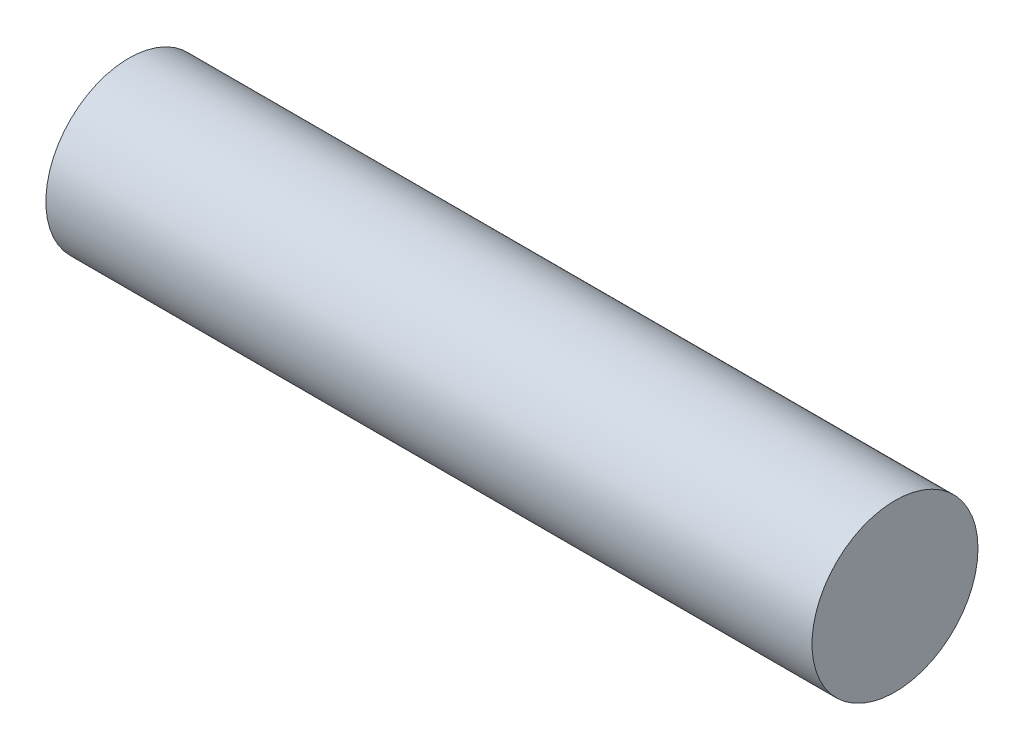
ISO-10303-21;
HEADER;
FILE_DESCRIPTION(('STEP AP214'),'2;1');
FILE_NAME('part.step','',(''),(''),'','','');
FILE_SCHEMA(('AUTOMOTIVE_DESIGN { 1 0 10303 214 1 1 1 1 }'));
ENDSEC;
DATA;
#1=APPLICATION_CONTEXT('core data for automotive mechanical design processes');
#2=APPLICATION_PROTOCOL_DEFINITION('international standard','automotive_design',2000,#1);
#3=PRODUCT_CONTEXT('',#1,'mechanical');
#4=PRODUCT('Part','Part','',(#3));
#5=PRODUCT_RELATED_PRODUCT_CATEGORY('part','',(#4));
#6=PRODUCT_DEFINITION_FORMATION('','',#4);
#7=PRODUCT_DEFINITION_CONTEXT('part definition',#1,'design');
#8=PRODUCT_DEFINITION('design','',#6,#7);
#9=PRODUCT_DEFINITION_SHAPE('','',#8);
#10=(LENGTH_UNIT() NAMED_UNIT(*) SI_UNIT(.MILLI.,.METRE.));
#11=(NAMED_UNIT(*) PLANE_ANGLE_UNIT() SI_UNIT($,.RADIAN.));
#12=(NAMED_UNIT(*) SI_UNIT($,.STERADIAN.) SOLID_ANGLE_UNIT());
#13=UNCERTAINTY_MEASURE_WITH_UNIT(LENGTH_MEASURE(1.E-05),#10,'distance_accuracy_value','');
#14=(GEOMETRIC_REPRESENTATION_CONTEXT(3) GLOBAL_UNCERTAINTY_ASSIGNED_CONTEXT((#13)) GLOBAL_UNIT_ASSIGNED_CONTEXT((#10,
#11,#12)) REPRESENTATION_CONTEXT('',''));
#15=CARTESIAN_POINT('',(0.,0.,0.));
#16=DIRECTION('',(0.,0.,1.));
#17=DIRECTION('',(1.,0.,0.));
#18=AXIS2_PLACEMENT_3D('',#15,#16,#17);
#19=CARTESIAN_POINT('',(10.,13.585377771095,-7.15207021744043));
#20=DIRECTION('',(-1.,0.,0.));
#21=DIRECTION('',(0.,0.,1.));
#22=AXIS2_PLACEMENT_3D('',#19,#20,#21);
#23=CYLINDRICAL_SURFACE('',#22,1.08306532407136);
#24=CARTESIAN_POINT('',(10.,13.585377771095,-7.15207021744043));
#25=DIRECTION('',(1.,0.,0.));
#26=DIRECTION('',(0.,0.,-1.));
#27=AXIS2_PLACEMENT_3D('',#24,#25,#26);
#28=CIRCLE('',#27,1.08306532407136);
#29=CARTESIAN_POINT('',(10.,13.585377771095,-8.2351355415118));
#30=VERTEX_POINT('',#29);
#31=EDGE_CURVE('E10',#30,#30,#28,.T.);
#32=ORIENTED_EDGE('',*,*,#31,.F.);
#33=EDGE_LOOP('',(#32));
#34=FACE_BOUND('',#33,.T.);
#35=CARTESIAN_POINT('',(0.,13.585377771095,-7.15207021744043));
#36=DIRECTION('',(1.,0.,0.));
#37=DIRECTION('',(0.,0.,-1.));
#38=AXIS2_PLACEMENT_3D('',#35,#36,#37);
#39=CIRCLE('',#38,1.08306532407136);
#40=CARTESIAN_POINT('',(0.,13.585377771095,-8.2351355415118));
#41=VERTEX_POINT('',#40);
#42=EDGE_CURVE('E38',#41,#41,#39,.T.);
#43=ORIENTED_EDGE('',*,*,#42,.T.);
#44=EDGE_LOOP('',(#43));
#45=FACE_BOUND('',#44,.T.);
#46=ADVANCED_FACE('F35',(#34,#45),#23,.T.);
#47=CARTESIAN_POINT('',(10.,13.585377771095,-7.15207021744043));
#48=DIRECTION('',(1.,0.,0.));
#49=DIRECTION('',(0.,0.,-1.));
#50=AXIS2_PLACEMENT_3D('',#47,#48,#49);
#51=PLANE('',#50);
#52=ORIENTED_EDGE('',*,*,#31,.T.);
#53=EDGE_LOOP('',(#52));
#54=FACE_BOUND('',#53,.T.);
#55=ADVANCED_FACE('F50',(#54),#51,.T.);
#56=CARTESIAN_POINT('',(0.,13.585377771095,-7.15207021744043));
#57=DIRECTION('',(1.,0.,0.));
#58=DIRECTION('',(0.,0.,-1.));
#59=AXIS2_PLACEMENT_3D('',#56,#57,#58);
#60=PLANE('',#59);
#61=ORIENTED_EDGE('',*,*,#42,.F.);
#62=EDGE_LOOP('',(#61));
#63=FACE_BOUND('',#62,.T.);
#64=ADVANCED_FACE('F48',(#63),#60,.F.);
#65=CLOSED_SHELL('',(#46,#55,#64));
#66=MANIFOLD_SOLID_BREP('B2',#65);
#67=ADVANCED_BREP_SHAPE_REPRESENTATION('',(#18,#66),#14);
#68=SHAPE_DEFINITION_REPRESENTATION(#9,#67);
ENDSEC;
END-ISO-10303-21;
